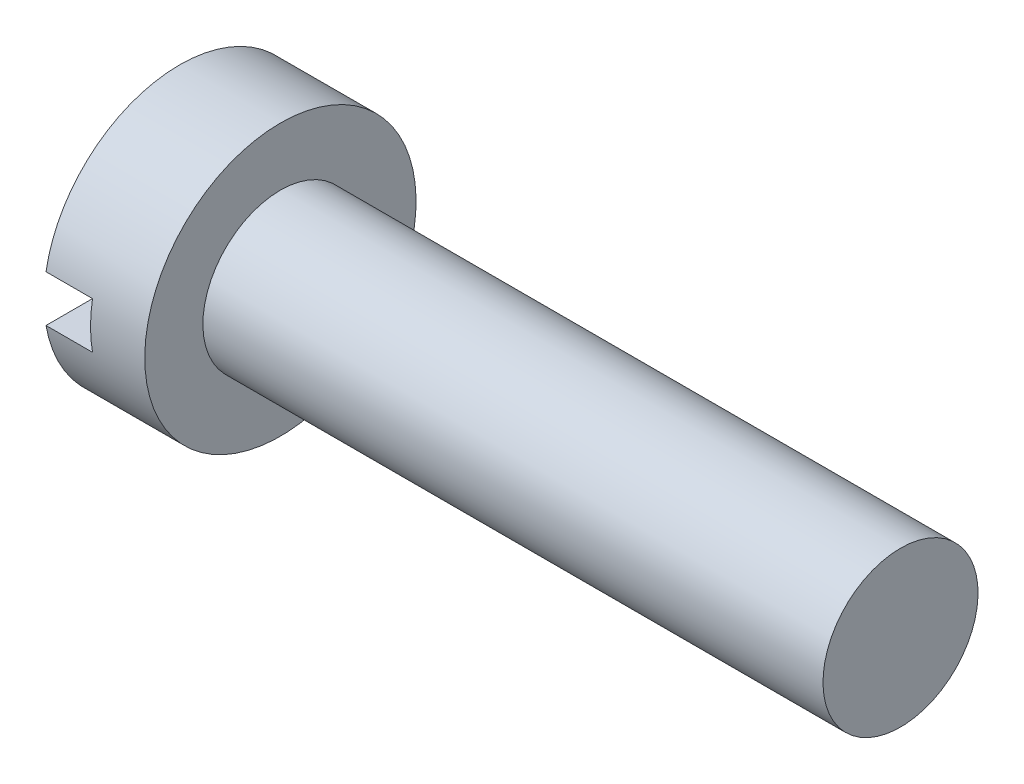
ISO-10303-21;
HEADER;
FILE_DESCRIPTION(('STEP AP214'),'2;1');
FILE_NAME('part.step','',(''),(''),'','','');
FILE_SCHEMA(('AUTOMOTIVE_DESIGN { 1 0 10303 214 1 1 1 1 }'));
ENDSEC;
DATA;
#1=APPLICATION_CONTEXT('core data for automotive mechanical design processes');
#2=APPLICATION_PROTOCOL_DEFINITION('international standard','automotive_design',2000,#1);
#3=PRODUCT_CONTEXT('',#1,'mechanical');
#4=PRODUCT('Part','Part','',(#3));
#5=PRODUCT_RELATED_PRODUCT_CATEGORY('part','',(#4));
#6=PRODUCT_DEFINITION_FORMATION('','',#4);
#7=PRODUCT_DEFINITION_CONTEXT('part definition',#1,'design');
#8=PRODUCT_DEFINITION('design','',#6,#7);
#9=PRODUCT_DEFINITION_SHAPE('','',#8);
#10=(LENGTH_UNIT() NAMED_UNIT(*) SI_UNIT(.MILLI.,.METRE.));
#11=(NAMED_UNIT(*) PLANE_ANGLE_UNIT() SI_UNIT($,.RADIAN.));
#12=(NAMED_UNIT(*) SI_UNIT($,.STERADIAN.) SOLID_ANGLE_UNIT());
#13=UNCERTAINTY_MEASURE_WITH_UNIT(LENGTH_MEASURE(1.E-05),#10,'distance_accuracy_value','');
#14=(GEOMETRIC_REPRESENTATION_CONTEXT(3) GLOBAL_UNCERTAINTY_ASSIGNED_CONTEXT((#13)) GLOBAL_UNIT_ASSIGNED_CONTEXT((#10,
#11,#12)) REPRESENTATION_CONTEXT('',''));
#15=CARTESIAN_POINT('',(0.,0.,0.));
#16=DIRECTION('',(0.,0.,1.));
#17=DIRECTION('',(1.,0.,0.));
#18=AXIS2_PLACEMENT_3D('',#15,#16,#17);
#19=CARTESIAN_POINT('',(0.,0.,0.));
#20=DIRECTION('',(-1.,0.,0.));
#21=DIRECTION('',(0.,-1.,0.));
#22=AXIS2_PLACEMENT_3D('',#19,#20,#21);
#23=PLANE('',#22);
#24=DIRECTION('',(0.,0.,-1.));
#25=VECTOR('',#24,1.);
#26=CARTESIAN_POINT('',(0.,0.599999999999996,-3.5));
#27=LINE('',#26,#25);
#28=CARTESIAN_POINT('',(0.,0.599999999999999,3.44818792991333));
#29=VERTEX_POINT('',#28);
#30=CARTESIAN_POINT('',(0.,0.599999999999996,-3.44818792991333));
#31=VERTEX_POINT('',#30);
#32=EDGE_CURVE('E83',#29,#31,#27,.T.);
#33=ORIENTED_EDGE('',*,*,#32,.F.);
#34=CARTESIAN_POINT('',(0.,0.,0.));
#35=DIRECTION('',(1.,0.,0.));
#36=DIRECTION('',(0.,1.,0.));
#37=AXIS2_PLACEMENT_3D('',#34,#35,#36);
#38=CIRCLE('',#37,3.5);
#39=EDGE_CURVE('E89',#31,#29,#38,.T.);
#40=ORIENTED_EDGE('',*,*,#39,.F.);
#41=EDGE_LOOP('',(#33,#40));
#42=FACE_BOUND('',#41,.T.);
#43=ADVANCED_FACE('F33',(#42),#23,.T.);
#44=DIRECTION('',(0.,0.,1.));
#45=VECTOR('',#44,1.);
#46=CARTESIAN_POINT('',(0.,-0.600000000000001,-3.5));
#47=LINE('',#46,#45);
#48=CARTESIAN_POINT('',(0.,-0.600000000000001,-3.44818792991333));
#49=VERTEX_POINT('',#48);
#50=CARTESIAN_POINT('',(0.,-0.599999999999999,3.44818792991333));
#51=VERTEX_POINT('',#50);
#52=EDGE_CURVE('E77',#49,#51,#47,.T.);
#53=ORIENTED_EDGE('',*,*,#52,.F.);
#54=EDGE_CURVE('E82',#51,#49,#38,.T.);
#55=ORIENTED_EDGE('',*,*,#54,.F.);
#56=EDGE_LOOP('',(#53,#55));
#57=FACE_BOUND('',#56,.T.);
#58=ADVANCED_FACE('F35',(#57),#23,.T.);
#59=CARTESIAN_POINT('',(18.6,0.,0.));
#60=DIRECTION('',(1.,0.,0.));
#61=DIRECTION('',(0.,1.,0.));
#62=AXIS2_PLACEMENT_3D('',#59,#60,#61);
#63=CYLINDRICAL_SURFACE('',#62,3.5);
#64=DIRECTION('',(1.,0.,0.));
#65=VECTOR('',#64,1.);
#66=CARTESIAN_POINT('',(18.6,0.599999999999996,-3.44818792991333));
#67=LINE('',#66,#65);
#68=CARTESIAN_POINT('',(1.2,0.599999999999996,-3.44818792991333));
#69=VERTEX_POINT('',#68);
#70=EDGE_CURVE('E11',#31,#69,#67,.T.);
#71=ORIENTED_EDGE('',*,*,#70,.F.);
#72=ORIENTED_EDGE('',*,*,#39,.T.);
#73=DIRECTION('',(1.,0.,0.));
#74=VECTOR('',#73,1.);
#75=CARTESIAN_POINT('',(18.6,0.599999999999999,3.44818792991333));
#76=LINE('',#75,#74);
#77=CARTESIAN_POINT('',(1.2,0.599999999999999,3.44818792991333));
#78=VERTEX_POINT('',#77);
#79=EDGE_CURVE('E98',#78,#29,#76,.F.);
#80=ORIENTED_EDGE('',*,*,#79,.F.);
#81=CARTESIAN_POINT('',(1.2,0.,0.));
#82=DIRECTION('',(-1.,0.,0.));
#83=DIRECTION('',(0.,0.,1.));
#84=AXIS2_PLACEMENT_3D('',#81,#82,#83);
#85=CIRCLE('',#84,3.5);
#86=CARTESIAN_POINT('',(1.2,-0.599999999999999,3.44818792991333));
#87=VERTEX_POINT('',#86);
#88=EDGE_CURVE('E48',#78,#87,#85,.F.);
#89=ORIENTED_EDGE('',*,*,#88,.T.);
#90=DIRECTION('',(1.,0.,0.));
#91=VECTOR('',#90,1.);
#92=CARTESIAN_POINT('',(18.6,-0.599999999999999,3.44818792991333));
#93=LINE('',#92,#91);
#94=EDGE_CURVE('E88',#51,#87,#93,.T.);
#95=ORIENTED_EDGE('',*,*,#94,.F.);
#96=ORIENTED_EDGE('',*,*,#54,.T.);
#97=DIRECTION('',(1.,0.,0.));
#98=VECTOR('',#97,1.);
#99=CARTESIAN_POINT('',(18.6,-0.600000000000001,-3.44818792991333));
#100=LINE('',#99,#98);
#101=CARTESIAN_POINT('',(1.2,-0.600000000000001,-3.44818792991333));
#102=VERTEX_POINT('',#101);
#103=EDGE_CURVE('E41',#102,#49,#100,.F.);
#104=ORIENTED_EDGE('',*,*,#103,.F.);
#105=EDGE_CURVE('E56',#102,#69,#85,.F.);
#106=ORIENTED_EDGE('',*,*,#105,.T.);
#107=EDGE_LOOP('',(#71,#72,#80,#89,#95,#96,#104,#106));
#108=FACE_BOUND('',#107,.T.);
#109=CARTESIAN_POINT('',(2.6,0.,0.));
#110=DIRECTION('',(1.,0.,0.));
#111=DIRECTION('',(0.,1.,0.));
#112=AXIS2_PLACEMENT_3D('',#109,#110,#111);
#113=CIRCLE('',#112,3.5);
#114=CARTESIAN_POINT('',(2.6,3.5,0.));
#115=VERTEX_POINT('',#114);
#116=EDGE_CURVE('E93',#115,#115,#113,.T.);
#117=ORIENTED_EDGE('',*,*,#116,.F.);
#118=EDGE_LOOP('',(#117));
#119=FACE_BOUND('',#118,.T.);
#120=ADVANCED_FACE('F86',(#108,#119),#63,.T.);
#121=CARTESIAN_POINT('',(2.6,3.5,0.));
#122=DIRECTION('',(1.,0.,0.));
#123=DIRECTION('',(0.,1.,0.));
#124=AXIS2_PLACEMENT_3D('',#121,#122,#123);
#125=PLANE('',#124);
#126=ORIENTED_EDGE('',*,*,#116,.T.);
#127=EDGE_LOOP('',(#126));
#128=FACE_BOUND('',#127,.T.);
#129=CARTESIAN_POINT('',(2.6,0.,0.));
#130=DIRECTION('',(1.,0.,0.));
#131=DIRECTION('',(0.,1.,0.));
#132=AXIS2_PLACEMENT_3D('',#129,#130,#131);
#133=CIRCLE('',#132,2.);
#134=CARTESIAN_POINT('',(2.6,2.,0.));
#135=VERTEX_POINT('',#134);
#136=EDGE_CURVE('E111',#135,#135,#133,.T.);
#137=ORIENTED_EDGE('',*,*,#136,.F.);
#138=EDGE_LOOP('',(#137));
#139=FACE_BOUND('',#138,.T.);
#140=ADVANCED_FACE('F118',(#128,#139),#125,.T.);
#141=CARTESIAN_POINT('',(18.6,0.,0.));
#142=DIRECTION('',(1.,0.,0.));
#143=DIRECTION('',(0.,1.,0.));
#144=AXIS2_PLACEMENT_3D('',#141,#142,#143);
#145=CYLINDRICAL_SURFACE('',#144,2.);
#146=ORIENTED_EDGE('',*,*,#136,.T.);
#147=EDGE_LOOP('',(#146));
#148=FACE_BOUND('',#147,.T.);
#149=CARTESIAN_POINT('',(18.6,0.,0.));
#150=DIRECTION('',(1.,0.,0.));
#151=DIRECTION('',(0.,1.,0.));
#152=AXIS2_PLACEMENT_3D('',#149,#150,#151);
#153=CIRCLE('',#152,2.);
#154=CARTESIAN_POINT('',(18.6,2.,0.));
#155=VERTEX_POINT('',#154);
#156=EDGE_CURVE('E109',#155,#155,#153,.T.);
#157=ORIENTED_EDGE('',*,*,#156,.F.);
#158=EDGE_LOOP('',(#157));
#159=FACE_BOUND('',#158,.T.);
#160=ADVANCED_FACE('F125',(#148,#159),#145,.T.);
#161=CARTESIAN_POINT('',(18.6,2.,0.));
#162=DIRECTION('',(1.,0.,0.));
#163=DIRECTION('',(0.,1.,0.));
#164=AXIS2_PLACEMENT_3D('',#161,#162,#163);
#165=PLANE('',#164);
#166=ORIENTED_EDGE('',*,*,#156,.T.);
#167=EDGE_LOOP('',(#166));
#168=FACE_BOUND('',#167,.T.);
#169=ADVANCED_FACE('F150',(#168),#165,.T.);
#170=CARTESIAN_POINT('',(1.2,0.599999999999996,-3.5));
#171=DIRECTION('',(0.,1.,0.));
#172=DIRECTION('',(0.,0.,1.));
#173=AXIS2_PLACEMENT_3D('',#170,#171,#172);
#174=PLANE('',#173);
#175=ORIENTED_EDGE('',*,*,#79,.T.);
#176=ORIENTED_EDGE('',*,*,#32,.T.);
#177=ORIENTED_EDGE('',*,*,#70,.T.);
#178=DIRECTION('',(0.,0.,-1.));
#179=VECTOR('',#178,1.);
#180=CARTESIAN_POINT('',(1.2,0.599999999999996,-3.5));
#181=LINE('',#180,#179);
#182=EDGE_CURVE('E105',#78,#69,#181,.T.);
#183=ORIENTED_EDGE('',*,*,#182,.F.);
#184=EDGE_LOOP('',(#175,#176,#177,#183));
#185=FACE_BOUND('',#184,.T.);
#186=ADVANCED_FACE('F145',(#185),#174,.F.);
#187=CARTESIAN_POINT('',(1.2,-0.600000000000001,-3.5));
#188=DIRECTION('',(0.,-1.,0.));
#189=DIRECTION('',(0.,0.,-1.));
#190=AXIS2_PLACEMENT_3D('',#187,#188,#189);
#191=PLANE('',#190);
#192=ORIENTED_EDGE('',*,*,#103,.T.);
#193=ORIENTED_EDGE('',*,*,#52,.T.);
#194=ORIENTED_EDGE('',*,*,#94,.T.);
#195=DIRECTION('',(0.,0.,1.));
#196=VECTOR('',#195,1.);
#197=CARTESIAN_POINT('',(1.2,-0.600000000000001,-3.5));
#198=LINE('',#197,#196);
#199=EDGE_CURVE('E78',#102,#87,#198,.T.);
#200=ORIENTED_EDGE('',*,*,#199,.F.);
#201=EDGE_LOOP('',(#192,#193,#194,#200));
#202=FACE_BOUND('',#201,.T.);
#203=ADVANCED_FACE('F76',(#202),#191,.F.);
#204=CARTESIAN_POINT('',(1.2,0.,0.));
#205=DIRECTION('',(-1.,0.,0.));
#206=DIRECTION('',(0.,0.,1.));
#207=AXIS2_PLACEMENT_3D('',#204,#205,#206);
#208=PLANE('',#207);
#209=ORIENTED_EDGE('',*,*,#199,.T.);
#210=ORIENTED_EDGE('',*,*,#88,.F.);
#211=ORIENTED_EDGE('',*,*,#182,.T.);
#212=ORIENTED_EDGE('',*,*,#105,.F.);
#213=EDGE_LOOP('',(#209,#210,#211,#212));
#214=FACE_BOUND('',#213,.T.);
#215=ADVANCED_FACE('F160',(#214),#208,.T.);
#216=CLOSED_SHELL('',(#43,#58,#120,#140,#160,#169,#186,#203,#215));
#217=MANIFOLD_SOLID_BREP('B2',#216);
#218=ADVANCED_BREP_SHAPE_REPRESENTATION('',(#18,#217),#14);
#219=SHAPE_DEFINITION_REPRESENTATION(#9,#218);
ENDSEC;
END-ISO-10303-21;
